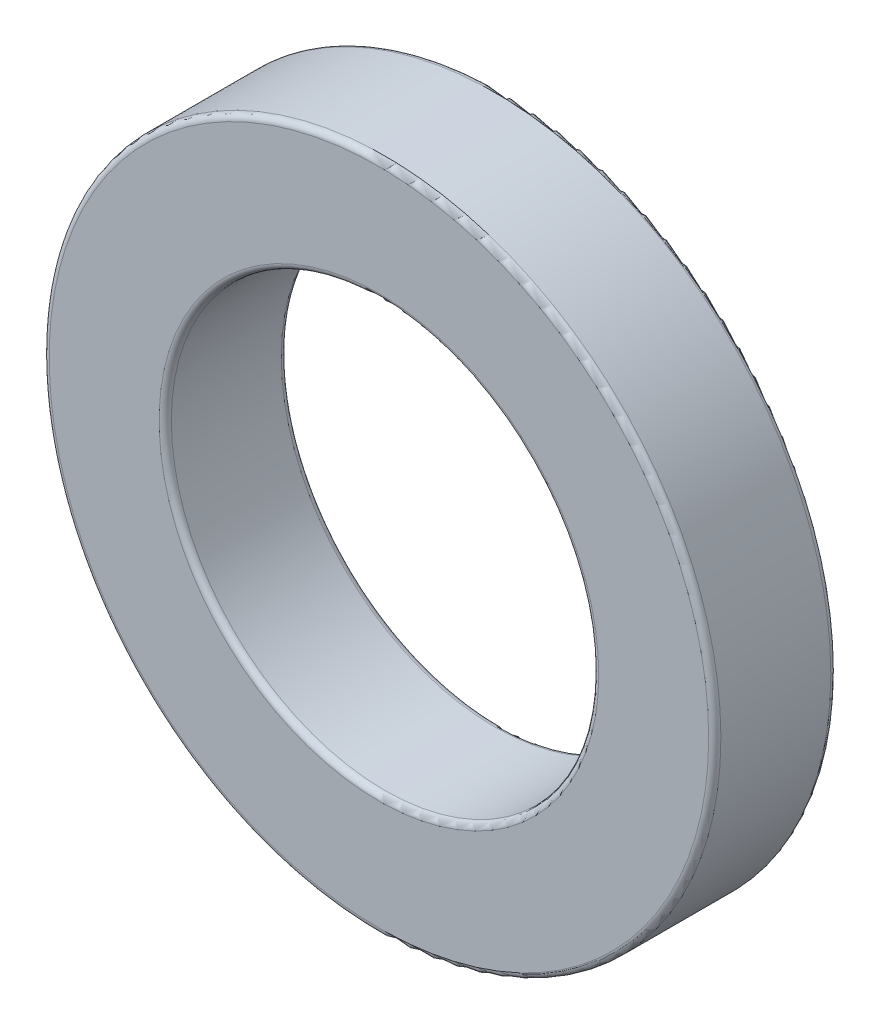
ISO-10303-21;
HEADER;
FILE_DESCRIPTION(('STEP AP214'),'2;1');
FILE_NAME('part.step','',(''),(''),'','','');
FILE_SCHEMA(('AUTOMOTIVE_DESIGN { 1 0 10303 214 1 1 1 1 }'));
ENDSEC;
DATA;
#1=APPLICATION_CONTEXT('core data for automotive mechanical design processes');
#2=APPLICATION_PROTOCOL_DEFINITION('international standard','automotive_design',2000,#1);
#3=PRODUCT_CONTEXT('',#1,'mechanical');
#4=PRODUCT('Part','Part','',(#3));
#5=PRODUCT_RELATED_PRODUCT_CATEGORY('part','',(#4));
#6=PRODUCT_DEFINITION_FORMATION('','',#4);
#7=PRODUCT_DEFINITION_CONTEXT('part definition',#1,'design');
#8=PRODUCT_DEFINITION('design','',#6,#7);
#9=PRODUCT_DEFINITION_SHAPE('','',#8);
#10=(LENGTH_UNIT() NAMED_UNIT(*) SI_UNIT(.MILLI.,.METRE.));
#11=(NAMED_UNIT(*) PLANE_ANGLE_UNIT() SI_UNIT($,.RADIAN.));
#12=(NAMED_UNIT(*) SI_UNIT($,.STERADIAN.) SOLID_ANGLE_UNIT());
#13=UNCERTAINTY_MEASURE_WITH_UNIT(LENGTH_MEASURE(1.E-05),#10,'distance_accuracy_value','');
#14=(GEOMETRIC_REPRESENTATION_CONTEXT(3) GLOBAL_UNCERTAINTY_ASSIGNED_CONTEXT((#13)) GLOBAL_UNIT_ASSIGNED_CONTEXT((#10,
#11,#12)) REPRESENTATION_CONTEXT('',''));
#15=CARTESIAN_POINT('',(0.,0.,0.));
#16=DIRECTION('',(0.,0.,1.));
#17=DIRECTION('',(1.,0.,0.));
#18=AXIS2_PLACEMENT_3D('',#15,#16,#17);
#19=CARTESIAN_POINT('',(0.,0.,10.));
#20=DIRECTION('',(0.,0.,1.));
#21=DIRECTION('',(1.,0.,0.));
#22=AXIS2_PLACEMENT_3D('',#19,#20,#21);
#23=PLANE('',#22);
#24=CARTESIAN_POINT('',(0.,0.,10.));
#25=DIRECTION('',(0.,0.,1.));
#26=DIRECTION('',(1.,0.,0.));
#27=AXIS2_PLACEMENT_3D('',#24,#25,#26);
#28=CIRCLE('',#27,27.);
#29=CARTESIAN_POINT('',(27.,0.,10.));
#30=VERTEX_POINT('',#29);
#31=EDGE_CURVE('E39',#30,#30,#28,.T.);
#32=ORIENTED_EDGE('',*,*,#31,.T.);
#33=EDGE_LOOP('',(#32));
#34=FACE_BOUND('',#33,.T.);
#35=CARTESIAN_POINT('',(0.,0.,10.));
#36=DIRECTION('',(0.,0.,1.));
#37=DIRECTION('',(1.,0.,0.));
#38=AXIS2_PLACEMENT_3D('',#35,#36,#37);
#39=CIRCLE('',#38,18.);
#40=CARTESIAN_POINT('',(18.,0.,10.));
#41=VERTEX_POINT('',#40);
#42=EDGE_CURVE('E43',#41,#41,#39,.F.);
#43=ORIENTED_EDGE('',*,*,#42,.T.);
#44=EDGE_LOOP('',(#43));
#45=FACE_BOUND('',#44,.T.);
#46=ADVANCED_FACE('F28',(#34,#45),#23,.T.);
#47=CARTESIAN_POINT('',(0.,0.,0.));
#48=DIRECTION('',(0.,0.,1.));
#49=DIRECTION('',(1.,0.,0.));
#50=AXIS2_PLACEMENT_3D('',#47,#48,#49);
#51=PLANE('',#50);
#52=CARTESIAN_POINT('',(0.,0.,0.));
#53=DIRECTION('',(0.,0.,1.));
#54=DIRECTION('',(1.,0.,0.));
#55=AXIS2_PLACEMENT_3D('',#52,#53,#54);
#56=CIRCLE('',#55,27.);
#57=CARTESIAN_POINT('',(27.,0.,0.));
#58=VERTEX_POINT('',#57);
#59=EDGE_CURVE('E48',#58,#58,#56,.F.);
#60=ORIENTED_EDGE('',*,*,#59,.T.);
#61=EDGE_LOOP('',(#60));
#62=FACE_BOUND('',#61,.T.);
#63=CARTESIAN_POINT('',(0.,0.,0.));
#64=DIRECTION('',(0.,0.,1.));
#65=DIRECTION('',(1.,0.,0.));
#66=AXIS2_PLACEMENT_3D('',#63,#64,#65);
#67=CIRCLE('',#66,18.);
#68=CARTESIAN_POINT('',(18.,0.,0.));
#69=VERTEX_POINT('',#68);
#70=EDGE_CURVE('E51',#69,#69,#67,.T.);
#71=ORIENTED_EDGE('',*,*,#70,.T.);
#72=EDGE_LOOP('',(#71));
#73=FACE_BOUND('',#72,.T.);
#74=ADVANCED_FACE('F73',(#62,#73),#51,.F.);
#75=CARTESIAN_POINT('',(0.,0.,10.));
#76=DIRECTION('',(0.,0.,-1.));
#77=DIRECTION('',(-1.,0.,0.));
#78=AXIS2_PLACEMENT_3D('',#75,#76,#77);
#79=CYLINDRICAL_SURFACE('',#78,27.5);
#80=CARTESIAN_POINT('',(0.,0.,0.5));
#81=DIRECTION('',(0.,0.,1.));
#82=DIRECTION('',(1.,0.,0.));
#83=AXIS2_PLACEMENT_3D('',#80,#81,#82);
#84=CIRCLE('',#83,27.5);
#85=CARTESIAN_POINT('',(27.5,0.,0.5));
#86=VERTEX_POINT('',#85);
#87=EDGE_CURVE('E54',#86,#86,#84,.T.);
#88=ORIENTED_EDGE('',*,*,#87,.T.);
#89=EDGE_LOOP('',(#88));
#90=FACE_BOUND('',#89,.T.);
#91=CARTESIAN_POINT('',(0.,0.,9.5));
#92=DIRECTION('',(0.,0.,1.));
#93=DIRECTION('',(1.,0.,0.));
#94=AXIS2_PLACEMENT_3D('',#91,#92,#93);
#95=CIRCLE('',#94,27.5);
#96=CARTESIAN_POINT('',(27.5,0.,9.5));
#97=VERTEX_POINT('',#96);
#98=EDGE_CURVE('E57',#97,#97,#95,.F.);
#99=ORIENTED_EDGE('',*,*,#98,.T.);
#100=EDGE_LOOP('',(#99));
#101=FACE_BOUND('',#100,.T.);
#102=ADVANCED_FACE('F61',(#90,#101),#79,.T.);
#103=CARTESIAN_POINT('',(0.,0.,10.));
#104=DIRECTION('',(0.,0.,-1.));
#105=DIRECTION('',(-1.,0.,0.));
#106=AXIS2_PLACEMENT_3D('',#103,#104,#105);
#107=CYLINDRICAL_SURFACE('',#106,17.5);
#108=CARTESIAN_POINT('',(0.,0.,0.5));
#109=DIRECTION('',(0.,0.,1.));
#110=DIRECTION('',(1.,0.,0.));
#111=AXIS2_PLACEMENT_3D('',#108,#109,#110);
#112=CIRCLE('',#111,17.5);
#113=CARTESIAN_POINT('',(17.5,0.,0.5));
#114=VERTEX_POINT('',#113);
#115=EDGE_CURVE('E10',#114,#114,#112,.F.);
#116=ORIENTED_EDGE('',*,*,#115,.T.);
#117=EDGE_LOOP('',(#116));
#118=FACE_BOUND('',#117,.T.);
#119=CARTESIAN_POINT('',(0.,0.,9.5));
#120=DIRECTION('',(0.,0.,1.));
#121=DIRECTION('',(1.,0.,0.));
#122=AXIS2_PLACEMENT_3D('',#119,#120,#121);
#123=CIRCLE('',#122,17.5);
#124=CARTESIAN_POINT('',(17.5,0.,9.5));
#125=VERTEX_POINT('',#124);
#126=EDGE_CURVE('E35',#125,#125,#123,.T.);
#127=ORIENTED_EDGE('',*,*,#126,.T.);
#128=EDGE_LOOP('',(#127));
#129=FACE_BOUND('',#128,.T.);
#130=ADVANCED_FACE('F89',(#118,#129),#107,.F.);
#131=CARTESIAN_POINT('',(0.,0.,0.5));
#132=DIRECTION('',(0.,0.,1.));
#133=DIRECTION('',(1.,0.,0.));
#134=AXIS2_PLACEMENT_3D('',#131,#132,#133);
#135=TOROIDAL_SURFACE('',#134,27.,0.5);
#136=ORIENTED_EDGE('',*,*,#59,.F.);
#137=EDGE_LOOP('',(#136));
#138=FACE_BOUND('',#137,.T.);
#139=ORIENTED_EDGE('',*,*,#87,.F.);
#140=EDGE_LOOP('',(#139));
#141=FACE_BOUND('',#140,.T.);
#142=ADVANCED_FACE('F67',(#138,#141),#135,.T.);
#143=CARTESIAN_POINT('',(0.,0.,9.5));
#144=DIRECTION('',(0.,0.,1.));
#145=DIRECTION('',(1.,0.,0.));
#146=AXIS2_PLACEMENT_3D('',#143,#144,#145);
#147=TOROIDAL_SURFACE('',#146,27.,0.5);
#148=ORIENTED_EDGE('',*,*,#98,.F.);
#149=EDGE_LOOP('',(#148));
#150=FACE_BOUND('',#149,.T.);
#151=ORIENTED_EDGE('',*,*,#31,.F.);
#152=EDGE_LOOP('',(#151));
#153=FACE_BOUND('',#152,.T.);
#154=ADVANCED_FACE('F63',(#150,#153),#147,.T.);
#155=CARTESIAN_POINT('',(0.,0.,0.5));
#156=DIRECTION('',(0.,0.,1.));
#157=DIRECTION('',(1.,0.,0.));
#158=AXIS2_PLACEMENT_3D('',#155,#156,#157);
#159=TOROIDAL_SURFACE('',#158,18.,0.5);
#160=ORIENTED_EDGE('',*,*,#115,.F.);
#161=EDGE_LOOP('',(#160));
#162=FACE_BOUND('',#161,.T.);
#163=ORIENTED_EDGE('',*,*,#70,.F.);
#164=EDGE_LOOP('',(#163));
#165=FACE_BOUND('',#164,.T.);
#166=ADVANCED_FACE('F66',(#162,#165),#159,.T.);
#167=CARTESIAN_POINT('',(0.,0.,9.5));
#168=DIRECTION('',(0.,0.,1.));
#169=DIRECTION('',(1.,0.,0.));
#170=AXIS2_PLACEMENT_3D('',#167,#168,#169);
#171=TOROIDAL_SURFACE('',#170,18.,0.5);
#172=ORIENTED_EDGE('',*,*,#42,.F.);
#173=EDGE_LOOP('',(#172));
#174=FACE_BOUND('',#173,.T.);
#175=ORIENTED_EDGE('',*,*,#126,.F.);
#176=EDGE_LOOP('',(#175));
#177=FACE_BOUND('',#176,.T.);
#178=ADVANCED_FACE('F30',(#174,#177),#171,.T.);
#179=CLOSED_SHELL('',(#46,#74,#102,#130,#142,#154,#166,#178));
#180=MANIFOLD_SOLID_BREP('B2',#179);
#181=ADVANCED_BREP_SHAPE_REPRESENTATION('',(#18,#180),#14);
#182=SHAPE_DEFINITION_REPRESENTATION(#9,#181);
ENDSEC;
END-ISO-10303-21;
